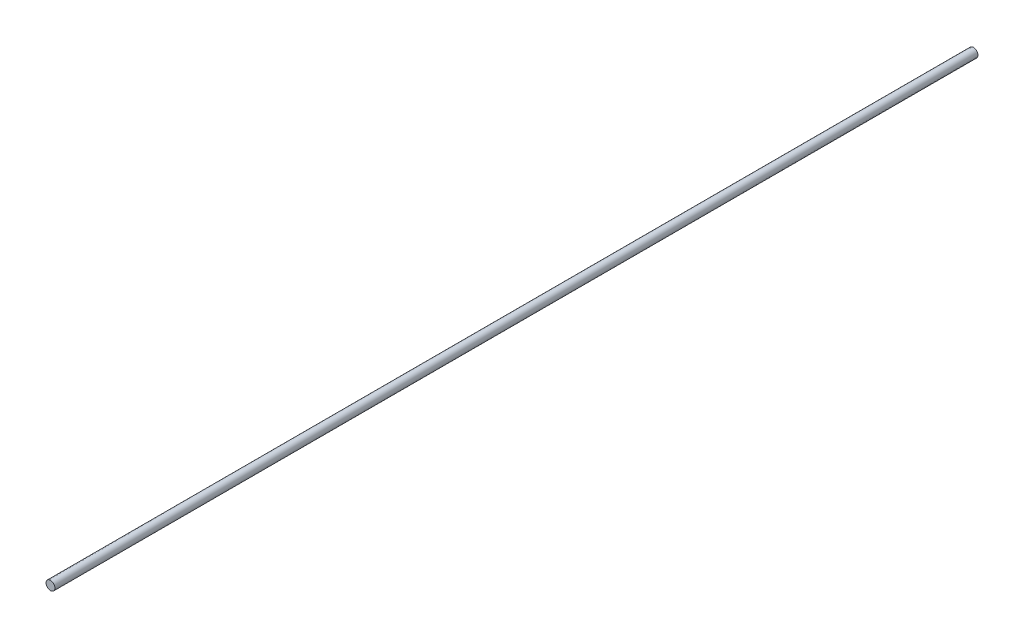
ISO-10303-21;
HEADER;
FILE_DESCRIPTION(('STEP AP214'),'2;1');
FILE_NAME('part.step','',(''),(''),'','','');
FILE_SCHEMA(('AUTOMOTIVE_DESIGN { 1 0 10303 214 1 1 1 1 }'));
ENDSEC;
DATA;
#1=APPLICATION_CONTEXT('core data for automotive mechanical design processes');
#2=APPLICATION_PROTOCOL_DEFINITION('international standard','automotive_design',2000,#1);
#3=PRODUCT_CONTEXT('',#1,'mechanical');
#4=PRODUCT('Part','Part','',(#3));
#5=PRODUCT_RELATED_PRODUCT_CATEGORY('part','',(#4));
#6=PRODUCT_DEFINITION_FORMATION('','',#4);
#7=PRODUCT_DEFINITION_CONTEXT('part definition',#1,'design');
#8=PRODUCT_DEFINITION('design','',#6,#7);
#9=PRODUCT_DEFINITION_SHAPE('','',#8);
#10=(LENGTH_UNIT() NAMED_UNIT(*) SI_UNIT(.MILLI.,.METRE.));
#11=(NAMED_UNIT(*) PLANE_ANGLE_UNIT() SI_UNIT($,.RADIAN.));
#12=(NAMED_UNIT(*) SI_UNIT($,.STERADIAN.) SOLID_ANGLE_UNIT());
#13=UNCERTAINTY_MEASURE_WITH_UNIT(LENGTH_MEASURE(1.E-05),#10,'distance_accuracy_value','');
#14=(GEOMETRIC_REPRESENTATION_CONTEXT(3) GLOBAL_UNCERTAINTY_ASSIGNED_CONTEXT((#13)) GLOBAL_UNIT_ASSIGNED_CONTEXT((#10,
#11,#12)) REPRESENTATION_CONTEXT('',''));
#15=CARTESIAN_POINT('',(0.,0.,0.));
#16=DIRECTION('',(0.,0.,1.));
#17=DIRECTION('',(1.,0.,0.));
#18=AXIS2_PLACEMENT_3D('',#15,#16,#17);
#19=CARTESIAN_POINT('',(0.,0.,-609.));
#20=DIRECTION('',(0.,0.,1.));
#21=DIRECTION('',(1.,0.,0.));
#22=AXIS2_PLACEMENT_3D('',#19,#20,#21);
#23=CYLINDRICAL_SURFACE('',#22,2.95);
#24=CARTESIAN_POINT('',(0.,0.,-609.));
#25=DIRECTION('',(0.,0.,1.));
#26=DIRECTION('',(1.,0.,0.));
#27=AXIS2_PLACEMENT_3D('',#24,#25,#26);
#28=CIRCLE('',#27,2.95);
#29=CARTESIAN_POINT('',(2.95,0.,-609.));
#30=VERTEX_POINT('',#29);
#31=EDGE_CURVE('E10',#30,#30,#28,.T.);
#32=ORIENTED_EDGE('',*,*,#31,.T.);
#33=EDGE_LOOP('',(#32));
#34=FACE_BOUND('',#33,.T.);
#35=CARTESIAN_POINT('',(0.,0.,0.));
#36=DIRECTION('',(0.,0.,1.));
#37=DIRECTION('',(1.,0.,0.));
#38=AXIS2_PLACEMENT_3D('',#35,#36,#37);
#39=CIRCLE('',#38,2.95);
#40=CARTESIAN_POINT('',(2.95,0.,0.));
#41=VERTEX_POINT('',#40);
#42=EDGE_CURVE('E38',#41,#41,#39,.T.);
#43=ORIENTED_EDGE('',*,*,#42,.F.);
#44=EDGE_LOOP('',(#43));
#45=FACE_BOUND('',#44,.T.);
#46=ADVANCED_FACE('F35',(#34,#45),#23,.T.);
#47=CARTESIAN_POINT('',(0.,0.,-609.));
#48=DIRECTION('',(0.,0.,1.));
#49=DIRECTION('',(1.,0.,0.));
#50=AXIS2_PLACEMENT_3D('',#47,#48,#49);
#51=PLANE('',#50);
#52=ORIENTED_EDGE('',*,*,#31,.F.);
#53=EDGE_LOOP('',(#52));
#54=FACE_BOUND('',#53,.T.);
#55=ADVANCED_FACE('F50',(#54),#51,.F.);
#56=CARTESIAN_POINT('',(0.,0.,0.));
#57=DIRECTION('',(0.,0.,1.));
#58=DIRECTION('',(1.,0.,0.));
#59=AXIS2_PLACEMENT_3D('',#56,#57,#58);
#60=PLANE('',#59);
#61=ORIENTED_EDGE('',*,*,#42,.T.);
#62=EDGE_LOOP('',(#61));
#63=FACE_BOUND('',#62,.T.);
#64=ADVANCED_FACE('F47',(#63),#60,.T.);
#65=CLOSED_SHELL('',(#46,#55,#64));
#66=MANIFOLD_SOLID_BREP('B2',#65);
#67=ADVANCED_BREP_SHAPE_REPRESENTATION('',(#18,#66),#14);
#68=SHAPE_DEFINITION_REPRESENTATION(#9,#67);
ENDSEC;
END-ISO-10303-21;
